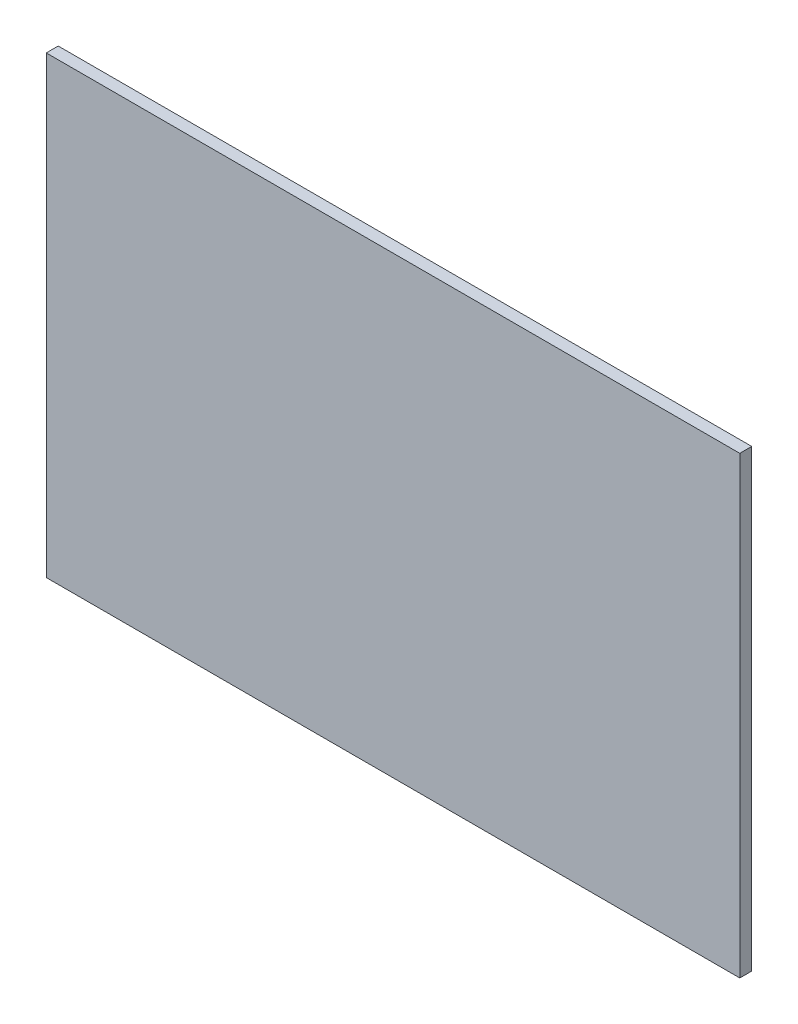
ISO-10303-21;
HEADER;
FILE_DESCRIPTION(('STEP AP214'),'2;1');
FILE_NAME('part.step','',(''),(''),'','','');
FILE_SCHEMA(('AUTOMOTIVE_DESIGN { 1 0 10303 214 1 1 1 1 }'));
ENDSEC;
DATA;
#1=APPLICATION_CONTEXT('core data for automotive mechanical design processes');
#2=APPLICATION_PROTOCOL_DEFINITION('international standard','automotive_design',2000,#1);
#3=PRODUCT_CONTEXT('',#1,'mechanical');
#4=PRODUCT('Part','Part','',(#3));
#5=PRODUCT_RELATED_PRODUCT_CATEGORY('part','',(#4));
#6=PRODUCT_DEFINITION_FORMATION('','',#4);
#7=PRODUCT_DEFINITION_CONTEXT('part definition',#1,'design');
#8=PRODUCT_DEFINITION('design','',#6,#7);
#9=PRODUCT_DEFINITION_SHAPE('','',#8);
#10=(LENGTH_UNIT() NAMED_UNIT(*) SI_UNIT(.MILLI.,.METRE.));
#11=(NAMED_UNIT(*) PLANE_ANGLE_UNIT() SI_UNIT($,.RADIAN.));
#12=(NAMED_UNIT(*) SI_UNIT($,.STERADIAN.) SOLID_ANGLE_UNIT());
#13=UNCERTAINTY_MEASURE_WITH_UNIT(LENGTH_MEASURE(1.E-05),#10,'distance_accuracy_value','');
#14=(GEOMETRIC_REPRESENTATION_CONTEXT(3) GLOBAL_UNCERTAINTY_ASSIGNED_CONTEXT((#13)) GLOBAL_UNIT_ASSIGNED_CONTEXT((#10,
#11,#12)) REPRESENTATION_CONTEXT('',''));
#15=CARTESIAN_POINT('',(0.,0.,0.));
#16=DIRECTION('',(0.,0.,1.));
#17=DIRECTION('',(1.,0.,0.));
#18=AXIS2_PLACEMENT_3D('',#15,#16,#17);
#19=CARTESIAN_POINT('',(-145.,95.,5.));
#20=DIRECTION('',(1.,0.,0.));
#21=DIRECTION('',(0.,0.,-1.));
#22=AXIS2_PLACEMENT_3D('',#19,#20,#21);
#23=PLANE('',#22);
#24=DIRECTION('',(0.,-1.,0.));
#25=VECTOR('',#24,1.);
#26=CARTESIAN_POINT('',(-145.,95.,0.));
#27=LINE('',#26,#25);
#28=CARTESIAN_POINT('',(-145.,95.,0.));
#29=VERTEX_POINT('',#28);
#30=CARTESIAN_POINT('',(-145.,-95.,0.));
#31=VERTEX_POINT('',#30);
#32=EDGE_CURVE('E104',#29,#31,#27,.T.);
#33=ORIENTED_EDGE('',*,*,#32,.T.);
#34=DIRECTION('',(0.,0.,-1.));
#35=VECTOR('',#34,1.);
#36=CARTESIAN_POINT('',(-145.,-95.,5.));
#37=LINE('',#36,#35);
#38=CARTESIAN_POINT('',(-145.,-95.,5.));
#39=VERTEX_POINT('',#38);
#40=EDGE_CURVE('E11',#39,#31,#37,.T.);
#41=ORIENTED_EDGE('',*,*,#40,.F.);
#42=DIRECTION('',(0.,-1.,0.));
#43=VECTOR('',#42,1.);
#44=CARTESIAN_POINT('',(-145.,95.,5.));
#45=LINE('',#44,#43);
#46=CARTESIAN_POINT('',(-145.,95.,5.));
#47=VERTEX_POINT('',#46);
#48=EDGE_CURVE('E92',#47,#39,#45,.T.);
#49=ORIENTED_EDGE('',*,*,#48,.F.);
#50=DIRECTION('',(0.,0.,-1.));
#51=VECTOR('',#50,1.);
#52=CARTESIAN_POINT('',(-145.,95.,5.));
#53=LINE('',#52,#51);
#54=EDGE_CURVE('E100',#47,#29,#53,.T.);
#55=ORIENTED_EDGE('',*,*,#54,.T.);
#56=EDGE_LOOP('',(#33,#41,#49,#55));
#57=FACE_BOUND('',#56,.T.);
#58=ADVANCED_FACE('F41',(#57),#23,.F.);
#59=CARTESIAN_POINT('',(145.,-95.,5.));
#60=DIRECTION('',(0.,1.,0.));
#61=DIRECTION('',(0.,0.,1.));
#62=AXIS2_PLACEMENT_3D('',#59,#60,#61);
#63=PLANE('',#62);
#64=DIRECTION('',(1.,0.,0.));
#65=VECTOR('',#64,1.);
#66=CARTESIAN_POINT('',(145.,-95.,0.));
#67=LINE('',#66,#65);
#68=CARTESIAN_POINT('',(145.,-95.,0.));
#69=VERTEX_POINT('',#68);
#70=EDGE_CURVE('E96',#31,#69,#67,.T.);
#71=ORIENTED_EDGE('',*,*,#70,.T.);
#72=DIRECTION('',(0.,0.,-1.));
#73=VECTOR('',#72,1.);
#74=CARTESIAN_POINT('',(145.,-95.,5.));
#75=LINE('',#74,#73);
#76=CARTESIAN_POINT('',(145.,-95.,5.));
#77=VERTEX_POINT('',#76);
#78=EDGE_CURVE('E49',#77,#69,#75,.T.);
#79=ORIENTED_EDGE('',*,*,#78,.F.);
#80=DIRECTION('',(1.,0.,0.));
#81=VECTOR('',#80,1.);
#82=CARTESIAN_POINT('',(145.,-95.,5.));
#83=LINE('',#82,#81);
#84=EDGE_CURVE('E87',#39,#77,#83,.T.);
#85=ORIENTED_EDGE('',*,*,#84,.F.);
#86=ORIENTED_EDGE('',*,*,#40,.T.);
#87=EDGE_LOOP('',(#71,#79,#85,#86));
#88=FACE_BOUND('',#87,.T.);
#89=ADVANCED_FACE('F95',(#88),#63,.F.);
#90=CARTESIAN_POINT('',(145.,95.,5.));
#91=DIRECTION('',(-1.,0.,0.));
#92=DIRECTION('',(0.,-1.,0.));
#93=AXIS2_PLACEMENT_3D('',#90,#91,#92);
#94=PLANE('',#93);
#95=DIRECTION('',(0.,1.,0.));
#96=VECTOR('',#95,1.);
#97=CARTESIAN_POINT('',(145.,95.,0.));
#98=LINE('',#97,#96);
#99=CARTESIAN_POINT('',(145.,95.,0.));
#100=VERTEX_POINT('',#99);
#101=EDGE_CURVE('E74',#69,#100,#98,.T.);
#102=ORIENTED_EDGE('',*,*,#101,.T.);
#103=DIRECTION('',(0.,0.,-1.));
#104=VECTOR('',#103,1.);
#105=CARTESIAN_POINT('',(145.,95.,5.));
#106=LINE('',#105,#104);
#107=CARTESIAN_POINT('',(145.,95.,5.));
#108=VERTEX_POINT('',#107);
#109=EDGE_CURVE('E97',#108,#100,#106,.T.);
#110=ORIENTED_EDGE('',*,*,#109,.F.);
#111=DIRECTION('',(0.,1.,0.));
#112=VECTOR('',#111,1.);
#113=CARTESIAN_POINT('',(145.,95.,5.));
#114=LINE('',#113,#112);
#115=EDGE_CURVE('E90',#77,#108,#114,.T.);
#116=ORIENTED_EDGE('',*,*,#115,.F.);
#117=ORIENTED_EDGE('',*,*,#78,.T.);
#118=EDGE_LOOP('',(#102,#110,#116,#117));
#119=FACE_BOUND('',#118,.T.);
#120=ADVANCED_FACE('F98',(#119),#94,.F.);
#121=CARTESIAN_POINT('',(145.,95.,5.));
#122=DIRECTION('',(0.,-1.,0.));
#123=DIRECTION('',(1.,0.,0.));
#124=AXIS2_PLACEMENT_3D('',#121,#122,#123);
#125=PLANE('',#124);
#126=DIRECTION('',(-1.,0.,0.));
#127=VECTOR('',#126,1.);
#128=CARTESIAN_POINT('',(145.,95.,0.));
#129=LINE('',#128,#127);
#130=EDGE_CURVE('E80',#100,#29,#129,.T.);
#131=ORIENTED_EDGE('',*,*,#130,.T.);
#132=ORIENTED_EDGE('',*,*,#54,.F.);
#133=DIRECTION('',(-1.,0.,0.));
#134=VECTOR('',#133,1.);
#135=CARTESIAN_POINT('',(145.,95.,5.));
#136=LINE('',#135,#134);
#137=EDGE_CURVE('E57',#108,#47,#136,.T.);
#138=ORIENTED_EDGE('',*,*,#137,.F.);
#139=ORIENTED_EDGE('',*,*,#109,.T.);
#140=EDGE_LOOP('',(#131,#132,#138,#139));
#141=FACE_BOUND('',#140,.T.);
#142=ADVANCED_FACE('F111',(#141),#125,.F.);
#143=CARTESIAN_POINT('',(0.,0.,5.));
#144=DIRECTION('',(0.,0.,-1.));
#145=DIRECTION('',(-1.,0.,0.));
#146=AXIS2_PLACEMENT_3D('',#143,#144,#145);
#147=PLANE('',#146);
#148=ORIENTED_EDGE('',*,*,#48,.T.);
#149=ORIENTED_EDGE('',*,*,#84,.T.);
#150=ORIENTED_EDGE('',*,*,#115,.T.);
#151=ORIENTED_EDGE('',*,*,#137,.T.);
#152=EDGE_LOOP('',(#148,#149,#150,#151));
#153=FACE_BOUND('',#152,.T.);
#154=ADVANCED_FACE('F88',(#153),#147,.F.);
#155=CARTESIAN_POINT('',(0.,0.,0.));
#156=DIRECTION('',(0.,0.,-1.));
#157=DIRECTION('',(-1.,0.,0.));
#158=AXIS2_PLACEMENT_3D('',#155,#156,#157);
#159=PLANE('',#158);
#160=ORIENTED_EDGE('',*,*,#32,.F.);
#161=ORIENTED_EDGE('',*,*,#130,.F.);
#162=ORIENTED_EDGE('',*,*,#101,.F.);
#163=ORIENTED_EDGE('',*,*,#70,.F.);
#164=EDGE_LOOP('',(#160,#161,#162,#163));
#165=FACE_BOUND('',#164,.T.);
#166=ADVANCED_FACE('F114',(#165),#159,.T.);
#167=CLOSED_SHELL('',(#58,#89,#120,#142,#154,#166));
#168=MANIFOLD_SOLID_BREP('B2',#167);
#169=ADVANCED_BREP_SHAPE_REPRESENTATION('',(#18,#168),#14);
#170=SHAPE_DEFINITION_REPRESENTATION(#9,#169);
ENDSEC;
END-ISO-10303-21;
